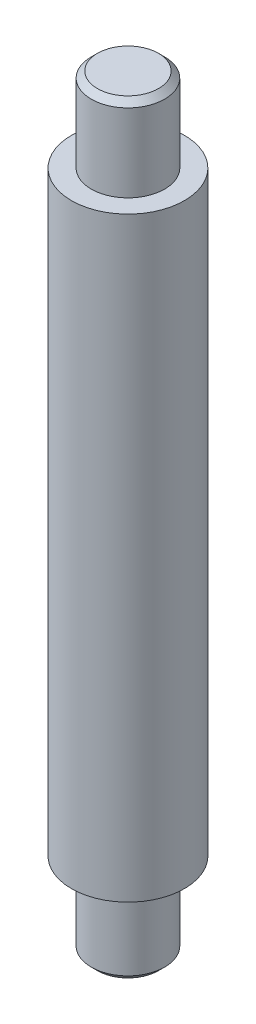
ISO-10303-21;
HEADER;
FILE_DESCRIPTION(('STEP AP214'),'2;1');
FILE_NAME('part.step','',(''),(''),'','','');
FILE_SCHEMA(('AUTOMOTIVE_DESIGN { 1 0 10303 214 1 1 1 1 }'));
ENDSEC;
DATA;
#1=APPLICATION_CONTEXT('core data for automotive mechanical design processes');
#2=APPLICATION_PROTOCOL_DEFINITION('international standard','automotive_design',2000,#1);
#3=PRODUCT_CONTEXT('',#1,'mechanical');
#4=PRODUCT('Part','Part','',(#3));
#5=PRODUCT_RELATED_PRODUCT_CATEGORY('part','',(#4));
#6=PRODUCT_DEFINITION_FORMATION('','',#4);
#7=PRODUCT_DEFINITION_CONTEXT('part definition',#1,'design');
#8=PRODUCT_DEFINITION('design','',#6,#7);
#9=PRODUCT_DEFINITION_SHAPE('','',#8);
#10=(LENGTH_UNIT() NAMED_UNIT(*) SI_UNIT(.MILLI.,.METRE.));
#11=(NAMED_UNIT(*) PLANE_ANGLE_UNIT() SI_UNIT($,.RADIAN.));
#12=(NAMED_UNIT(*) SI_UNIT($,.STERADIAN.) SOLID_ANGLE_UNIT());
#13=UNCERTAINTY_MEASURE_WITH_UNIT(LENGTH_MEASURE(1.E-05),#10,'distance_accuracy_value','');
#14=(GEOMETRIC_REPRESENTATION_CONTEXT(3) GLOBAL_UNCERTAINTY_ASSIGNED_CONTEXT((#13)) GLOBAL_UNIT_ASSIGNED_CONTEXT((#10,
#11,#12)) REPRESENTATION_CONTEXT('',''));
#15=CARTESIAN_POINT('',(0.,0.,0.));
#16=DIRECTION('',(0.,0.,1.));
#17=DIRECTION('',(1.,0.,0.));
#18=AXIS2_PLACEMENT_3D('',#15,#16,#17);
#19=CARTESIAN_POINT('',(0.,12.5,0.));
#20=DIRECTION('',(0.,1.,0.));
#21=DIRECTION('',(0.,0.,1.));
#22=AXIS2_PLACEMENT_3D('',#19,#20,#21);
#23=PLANE('',#22);
#24=CARTESIAN_POINT('',(0.,12.4999999999886,0.));
#25=DIRECTION('',(0.,-1.,0.));
#26=DIRECTION('',(1.,0.,0.));
#27=AXIS2_PLACEMENT_3D('',#24,#25,#26);
#28=CIRCLE('',#27,1.0000000000332);
#29=CARTESIAN_POINT('',(1.0000000000332,12.4999999999886,0.));
#30=VERTEX_POINT('',#29);
#31=EDGE_CURVE('E18',#30,#30,#28,.T.);
#32=ORIENTED_EDGE('',*,*,#31,.F.);
#33=EDGE_LOOP('',(#32));
#34=FACE_BOUND('',#33,.T.);
#35=ADVANCED_FACE('F15',(#34),#23,.T.);
#36=CARTESIAN_POINT('',(0.,-12.5,0.));
#37=DIRECTION('',(0.,1.,0.));
#38=DIRECTION('',(0.,0.,1.));
#39=AXIS2_PLACEMENT_3D('',#36,#37,#38);
#40=PLANE('',#39);
#41=CARTESIAN_POINT('',(0.,-12.5000000000455,0.));
#42=DIRECTION('',(0.,1.,0.));
#43=DIRECTION('',(-1.,0.,0.));
#44=AXIS2_PLACEMENT_3D('',#41,#42,#43);
#45=CIRCLE('',#44,0.999999999976353);
#46=CARTESIAN_POINT('',(-0.999999999976353,-12.5000000000455,0.));
#47=VERTEX_POINT('',#46);
#48=EDGE_CURVE('E38',#47,#47,#45,.T.);
#49=ORIENTED_EDGE('',*,*,#48,.F.);
#50=EDGE_LOOP('',(#49));
#51=FACE_BOUND('',#50,.T.);
#52=ADVANCED_FACE('F50',(#51),#40,.F.);
#53=CARTESIAN_POINT('',(0.,12.3000000000388,0.));
#54=DIRECTION('',(0.,-1.,0.));
#55=DIRECTION('',(1.,0.,0.));
#56=AXIS2_PLACEMENT_3D('',#53,#54,#55);
#57=CONICAL_SURFACE('',#56,1.19999999998299,0.785398163397449);
#58=ORIENTED_EDGE('',*,*,#31,.T.);
#59=EDGE_LOOP('',(#58));
#60=FACE_BOUND('',#59,.T.);
#61=CARTESIAN_POINT('',(0.,12.3,0.));
#62=DIRECTION('',(0.,1.,0.));
#63=DIRECTION('',(0.,0.,1.));
#64=AXIS2_PLACEMENT_3D('',#61,#62,#63);
#65=CIRCLE('',#64,1.2);
#66=CARTESIAN_POINT('',(0.,12.3,1.2));
#67=VERTEX_POINT('',#66);
#68=EDGE_CURVE('E30',#67,#67,#65,.F.);
#69=ORIENTED_EDGE('',*,*,#68,.F.);
#70=EDGE_LOOP('',(#69));
#71=FACE_BOUND('',#70,.T.);
#72=ADVANCED_FACE('F46',(#60,#71),#57,.T.);
#73=CARTESIAN_POINT('',(0.,-12.3000000000957,0.));
#74=DIRECTION('',(0.,1.,0.));
#75=DIRECTION('',(-1.,0.,0.));
#76=AXIS2_PLACEMENT_3D('',#73,#74,#75);
#77=CONICAL_SURFACE('',#76,1.19999999992615,0.785398163397448);
#78=ORIENTED_EDGE('',*,*,#48,.T.);
#79=EDGE_LOOP('',(#78));
#80=FACE_BOUND('',#79,.T.);
#81=CARTESIAN_POINT('',(0.,-12.3,0.));
#82=DIRECTION('',(0.,1.,0.));
#83=DIRECTION('',(0.,0.,1.));
#84=AXIS2_PLACEMENT_3D('',#81,#82,#83);
#85=CIRCLE('',#84,1.2);
#86=CARTESIAN_POINT('',(0.,-12.3,1.2));
#87=VERTEX_POINT('',#86);
#88=EDGE_CURVE('E37',#87,#87,#85,.T.);
#89=ORIENTED_EDGE('',*,*,#88,.F.);
#90=EDGE_LOOP('',(#89));
#91=FACE_BOUND('',#90,.T.);
#92=ADVANCED_FACE('F78',(#80,#91),#77,.T.);
#93=CARTESIAN_POINT('',(0.,0.,0.));
#94=DIRECTION('',(0.,1.,0.));
#95=DIRECTION('',(0.,0.,1.));
#96=AXIS2_PLACEMENT_3D('',#93,#94,#95);
#97=CYLINDRICAL_SURFACE('',#96,1.2);
#98=CARTESIAN_POINT('',(0.,9.74999999999999,0.));
#99=DIRECTION('',(0.,1.,0.));
#100=DIRECTION('',(0.,0.,1.));
#101=AXIS2_PLACEMENT_3D('',#98,#99,#100);
#102=CIRCLE('',#101,1.2);
#103=CARTESIAN_POINT('',(0.,9.74999999999999,1.2));
#104=VERTEX_POINT('',#103);
#105=EDGE_CURVE('E35',#104,#104,#102,.F.);
#106=ORIENTED_EDGE('',*,*,#105,.F.);
#107=EDGE_LOOP('',(#106));
#108=FACE_BOUND('',#107,.T.);
#109=ORIENTED_EDGE('',*,*,#68,.T.);
#110=EDGE_LOOP('',(#109));
#111=FACE_BOUND('',#110,.T.);
#112=ADVANCED_FACE('F74',(#108,#111),#97,.T.);
#113=CARTESIAN_POINT('',(0.,0.,0.));
#114=DIRECTION('',(0.,1.,0.));
#115=DIRECTION('',(0.,0.,1.));
#116=AXIS2_PLACEMENT_3D('',#113,#114,#115);
#117=CYLINDRICAL_SURFACE('',#116,1.2);
#118=ORIENTED_EDGE('',*,*,#88,.T.);
#119=EDGE_LOOP('',(#118));
#120=FACE_BOUND('',#119,.T.);
#121=CARTESIAN_POINT('',(0.,-9.74999999999999,0.));
#122=DIRECTION('',(0.,1.,0.));
#123=DIRECTION('',(0.,0.,1.));
#124=AXIS2_PLACEMENT_3D('',#121,#122,#123);
#125=CIRCLE('',#124,1.2);
#126=CARTESIAN_POINT('',(0.,-9.74999999999999,1.2));
#127=VERTEX_POINT('',#126);
#128=EDGE_CURVE('E27',#127,#127,#125,.F.);
#129=ORIENTED_EDGE('',*,*,#128,.T.);
#130=EDGE_LOOP('',(#129));
#131=FACE_BOUND('',#130,.T.);
#132=ADVANCED_FACE('F70',(#120,#131),#117,.T.);
#133=CARTESIAN_POINT('',(0.,9.74999999999999,0.));
#134=DIRECTION('',(0.,1.,0.));
#135=DIRECTION('',(0.,0.,1.));
#136=AXIS2_PLACEMENT_3D('',#133,#134,#135);
#137=PLANE('',#136);
#138=ORIENTED_EDGE('',*,*,#105,.T.);
#139=EDGE_LOOP('',(#138));
#140=FACE_BOUND('',#139,.T.);
#141=CARTESIAN_POINT('',(0.,9.74999999999999,0.));
#142=DIRECTION('',(0.,1.,0.));
#143=DIRECTION('',(0.,0.,1.));
#144=AXIS2_PLACEMENT_3D('',#141,#142,#143);
#145=CIRCLE('',#144,1.85);
#146=CARTESIAN_POINT('',(0.,9.74999999999999,1.85));
#147=VERTEX_POINT('',#146);
#148=EDGE_CURVE('E22',#147,#147,#145,.F.);
#149=ORIENTED_EDGE('',*,*,#148,.F.);
#150=EDGE_LOOP('',(#149));
#151=FACE_BOUND('',#150,.T.);
#152=ADVANCED_FACE('F63',(#140,#151),#137,.T.);
#153=CARTESIAN_POINT('',(0.,-9.74999999999999,0.));
#154=DIRECTION('',(0.,1.,0.));
#155=DIRECTION('',(0.,0.,1.));
#156=AXIS2_PLACEMENT_3D('',#153,#154,#155);
#157=PLANE('',#156);
#158=ORIENTED_EDGE('',*,*,#128,.F.);
#159=EDGE_LOOP('',(#158));
#160=FACE_BOUND('',#159,.T.);
#161=CARTESIAN_POINT('',(0.,-9.74999999999999,0.));
#162=DIRECTION('',(0.,1.,0.));
#163=DIRECTION('',(0.,0.,1.));
#164=AXIS2_PLACEMENT_3D('',#161,#162,#163);
#165=CIRCLE('',#164,1.85);
#166=CARTESIAN_POINT('',(0.,-9.74999999999999,1.85));
#167=VERTEX_POINT('',#166);
#168=EDGE_CURVE('E10',#167,#167,#165,.T.);
#169=ORIENTED_EDGE('',*,*,#168,.F.);
#170=EDGE_LOOP('',(#169));
#171=FACE_BOUND('',#170,.T.);
#172=ADVANCED_FACE('F58',(#160,#171),#157,.F.);
#173=CARTESIAN_POINT('',(0.,0.,0.));
#174=DIRECTION('',(0.,1.,0.));
#175=DIRECTION('',(0.,0.,1.));
#176=AXIS2_PLACEMENT_3D('',#173,#174,#175);
#177=CYLINDRICAL_SURFACE('',#176,1.85);
#178=ORIENTED_EDGE('',*,*,#168,.T.);
#179=EDGE_LOOP('',(#178));
#180=FACE_BOUND('',#179,.T.);
#181=ORIENTED_EDGE('',*,*,#148,.T.);
#182=EDGE_LOOP('',(#181));
#183=FACE_BOUND('',#182,.T.);
#184=ADVANCED_FACE('F56',(#180,#183),#177,.T.);
#185=CLOSED_SHELL('',(#35,#52,#72,#92,#112,#132,#152,#172,#184));
#186=MANIFOLD_SOLID_BREP('B1',#185);
#187=ADVANCED_BREP_SHAPE_REPRESENTATION('',(#18,#186),#14);
#188=SHAPE_DEFINITION_REPRESENTATION(#9,#187);
ENDSEC;
END-ISO-10303-21;
